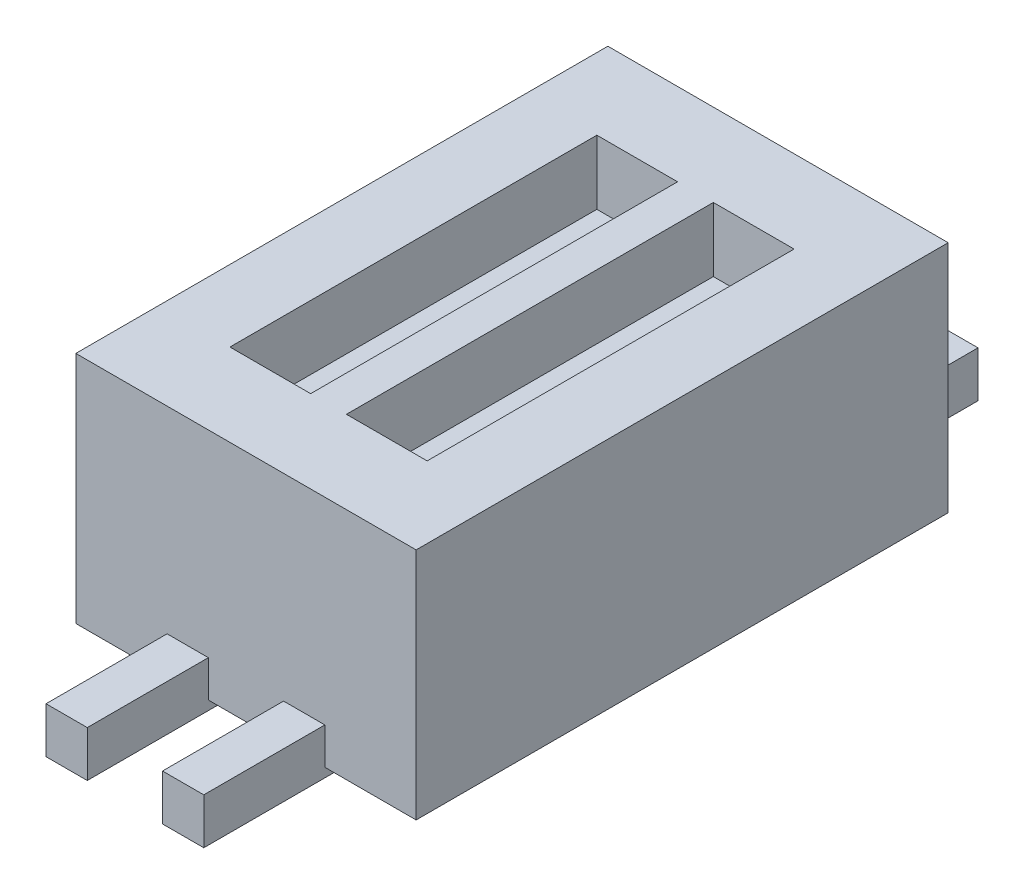
ISO-10303-21;
HEADER;
FILE_DESCRIPTION(('STEP AP214'),'2;1');
FILE_NAME('part.step','',(''),(''),'','','');
FILE_SCHEMA(('AUTOMOTIVE_DESIGN { 1 0 10303 214 1 1 1 1 }'));
ENDSEC;
DATA;
#1=APPLICATION_CONTEXT('core data for automotive mechanical design processes');
#2=APPLICATION_PROTOCOL_DEFINITION('international standard','automotive_design',2000,#1);
#3=PRODUCT_CONTEXT('',#1,'mechanical');
#4=PRODUCT('Part','Part','',(#3));
#5=PRODUCT_RELATED_PRODUCT_CATEGORY('part','',(#4));
#6=PRODUCT_DEFINITION_FORMATION('','',#4);
#7=PRODUCT_DEFINITION_CONTEXT('part definition',#1,'design');
#8=PRODUCT_DEFINITION('design','',#6,#7);
#9=PRODUCT_DEFINITION_SHAPE('','',#8);
#10=(LENGTH_UNIT() NAMED_UNIT(*) SI_UNIT(.MILLI.,.METRE.));
#11=(NAMED_UNIT(*) PLANE_ANGLE_UNIT() SI_UNIT($,.RADIAN.));
#12=(NAMED_UNIT(*) SI_UNIT($,.STERADIAN.) SOLID_ANGLE_UNIT());
#13=UNCERTAINTY_MEASURE_WITH_UNIT(LENGTH_MEASURE(1.E-05),#10,'distance_accuracy_value','');
#14=(GEOMETRIC_REPRESENTATION_CONTEXT(3) GLOBAL_UNCERTAINTY_ASSIGNED_CONTEXT((#13)) GLOBAL_UNIT_ASSIGNED_CONTEXT((#10,
#11,#12)) REPRESENTATION_CONTEXT('',''));
#15=CARTESIAN_POINT('',(0.,0.,0.));
#16=DIRECTION('',(0.,0.,1.));
#17=DIRECTION('',(1.,0.,0.));
#18=AXIS2_PLACEMENT_3D('',#15,#16,#17);
#19=CARTESIAN_POINT('',(0.,0.1,0.));
#20=DIRECTION('',(0.,1.,0.));
#21=DIRECTION('',(0.,0.,1.));
#22=AXIS2_PLACEMENT_3D('',#19,#20,#21);
#23=PLANE('',#22);
#24=DIRECTION('',(0.,0.,-1.));
#25=VECTOR('',#24,1.);
#26=CARTESIAN_POINT('',(0.41,0.1,0.));
#27=LINE('',#26,#25);
#28=CARTESIAN_POINT('',(0.41,0.1,-2.4));
#29=VERTEX_POINT('',#28);
#30=CARTESIAN_POINT('',(0.409999999999999,0.1,-2.9));
#31=VERTEX_POINT('',#30);
#32=EDGE_CURVE('E368',#29,#31,#27,.T.);
#33=ORIENTED_EDGE('',*,*,#32,.F.);
#34=DIRECTION('',(-1.,0.,0.));
#35=VECTOR('',#34,1.);
#36=CARTESIAN_POINT('',(0.,0.1,-2.4));
#37=LINE('',#36,#35);
#38=CARTESIAN_POINT('',(0.86,0.1,-2.4));
#39=VERTEX_POINT('',#38);
#40=EDGE_CURVE('E11',#39,#29,#37,.T.);
#41=ORIENTED_EDGE('',*,*,#40,.F.);
#42=DIRECTION('',(0.,0.,1.));
#43=VECTOR('',#42,1.);
#44=CARTESIAN_POINT('',(0.86,0.1,0.));
#45=LINE('',#44,#43);
#46=CARTESIAN_POINT('',(0.859999999999999,0.1,-2.9));
#47=VERTEX_POINT('',#46);
#48=EDGE_CURVE('E365',#47,#39,#45,.T.);
#49=ORIENTED_EDGE('',*,*,#48,.F.);
#50=DIRECTION('',(-1.,0.,0.));
#51=VECTOR('',#50,1.);
#52=CARTESIAN_POINT('',(-1.855,0.1,-2.9));
#53=LINE('',#52,#51);
#54=CARTESIAN_POINT('',(1.855,0.1,-2.9));
#55=VERTEX_POINT('',#54);
#56=EDGE_CURVE('E485',#55,#47,#53,.T.);
#57=ORIENTED_EDGE('',*,*,#56,.F.);
#58=DIRECTION('',(0.,0.,-1.));
#59=VECTOR('',#58,1.);
#60=CARTESIAN_POINT('',(1.855,0.1,-2.9));
#61=LINE('',#60,#59);
#62=CARTESIAN_POINT('',(1.855,0.1,2.9));
#63=VERTEX_POINT('',#62);
#64=EDGE_CURVE('E470',#63,#55,#61,.T.);
#65=ORIENTED_EDGE('',*,*,#64,.F.);
#66=DIRECTION('',(1.,0.,0.));
#67=VECTOR('',#66,1.);
#68=CARTESIAN_POINT('',(-1.855,0.1,2.9));
#69=LINE('',#68,#67);
#70=CARTESIAN_POINT('',(0.859999999999999,0.1,2.9));
#71=VERTEX_POINT('',#70);
#72=EDGE_CURVE('E491',#71,#63,#69,.T.);
#73=ORIENTED_EDGE('',*,*,#72,.F.);
#74=DIRECTION('',(0.,0.,1.));
#75=VECTOR('',#74,1.);
#76=CARTESIAN_POINT('',(0.86,0.1,0.));
#77=LINE('',#76,#75);
#78=CARTESIAN_POINT('',(0.86,0.1,2.4));
#79=VERTEX_POINT('',#78);
#80=EDGE_CURVE('E512',#79,#71,#77,.T.);
#81=ORIENTED_EDGE('',*,*,#80,.F.);
#82=DIRECTION('',(1.,0.,0.));
#83=VECTOR('',#82,1.);
#84=CARTESIAN_POINT('',(0.,0.1,2.4));
#85=LINE('',#84,#83);
#86=CARTESIAN_POINT('',(0.41,0.1,2.4));
#87=VERTEX_POINT('',#86);
#88=EDGE_CURVE('E509',#87,#79,#85,.T.);
#89=ORIENTED_EDGE('',*,*,#88,.F.);
#90=DIRECTION('',(0.,0.,-1.));
#91=VECTOR('',#90,1.);
#92=CARTESIAN_POINT('',(0.41,0.1,0.));
#93=LINE('',#92,#91);
#94=CARTESIAN_POINT('',(0.409999999999999,0.1,2.9));
#95=VERTEX_POINT('',#94);
#96=EDGE_CURVE('E506',#95,#87,#93,.T.);
#97=ORIENTED_EDGE('',*,*,#96,.F.);
#98=CARTESIAN_POINT('',(-0.41,0.1,2.9));
#99=VERTEX_POINT('',#98);
#100=EDGE_CURVE('E494',#99,#95,#69,.T.);
#101=ORIENTED_EDGE('',*,*,#100,.F.);
#102=DIRECTION('',(0.,0.,1.));
#103=VECTOR('',#102,1.);
#104=CARTESIAN_POINT('',(-0.41,0.1,0.));
#105=LINE('',#104,#103);
#106=CARTESIAN_POINT('',(-0.41,0.1,2.4));
#107=VERTEX_POINT('',#106);
#108=EDGE_CURVE('E523',#107,#99,#105,.T.);
#109=ORIENTED_EDGE('',*,*,#108,.F.);
#110=DIRECTION('',(1.,0.,0.));
#111=VECTOR('',#110,1.);
#112=CARTESIAN_POINT('',(0.,0.1,2.4));
#113=LINE('',#112,#111);
#114=CARTESIAN_POINT('',(-0.86,0.1,2.4));
#115=VERTEX_POINT('',#114);
#116=EDGE_CURVE('E520',#115,#107,#113,.T.);
#117=ORIENTED_EDGE('',*,*,#116,.F.);
#118=DIRECTION('',(0.,0.,-1.));
#119=VECTOR('',#118,1.);
#120=CARTESIAN_POINT('',(-0.86,0.1,0.));
#121=LINE('',#120,#119);
#122=CARTESIAN_POINT('',(-0.860000000000001,0.1,2.9));
#123=VERTEX_POINT('',#122);
#124=EDGE_CURVE('E517',#123,#115,#121,.T.);
#125=ORIENTED_EDGE('',*,*,#124,.F.);
#126=CARTESIAN_POINT('',(-1.855,0.1,2.9));
#127=VERTEX_POINT('',#126);
#128=EDGE_CURVE('E475',#127,#123,#69,.T.);
#129=ORIENTED_EDGE('',*,*,#128,.F.);
#130=DIRECTION('',(0.,0.,1.));
#131=VECTOR('',#130,1.);
#132=CARTESIAN_POINT('',(-1.855,0.1,-2.9));
#133=LINE('',#132,#131);
#134=CARTESIAN_POINT('',(-1.855,0.1,-2.9));
#135=VERTEX_POINT('',#134);
#136=EDGE_CURVE('E488',#135,#127,#133,.T.);
#137=ORIENTED_EDGE('',*,*,#136,.F.);
#138=CARTESIAN_POINT('',(-0.860000000000001,0.1,-2.9));
#139=VERTEX_POINT('',#138);
#140=EDGE_CURVE('E484',#139,#135,#53,.T.);
#141=ORIENTED_EDGE('',*,*,#140,.F.);
#142=DIRECTION('',(0.,0.,-1.));
#143=VECTOR('',#142,1.);
#144=CARTESIAN_POINT('',(-0.86,0.1,0.));
#145=LINE('',#144,#143);
#146=CARTESIAN_POINT('',(-0.86,0.1,-2.4));
#147=VERTEX_POINT('',#146);
#148=EDGE_CURVE('E401',#147,#139,#145,.T.);
#149=ORIENTED_EDGE('',*,*,#148,.F.);
#150=DIRECTION('',(-1.,0.,0.));
#151=VECTOR('',#150,1.);
#152=CARTESIAN_POINT('',(0.,0.1,-2.4));
#153=LINE('',#152,#151);
#154=CARTESIAN_POINT('',(-0.41,0.1,-2.4));
#155=VERTEX_POINT('',#154);
#156=EDGE_CURVE('E537',#155,#147,#153,.T.);
#157=ORIENTED_EDGE('',*,*,#156,.F.);
#158=DIRECTION('',(0.,0.,1.));
#159=VECTOR('',#158,1.);
#160=CARTESIAN_POINT('',(-0.41,0.1,0.));
#161=LINE('',#160,#159);
#162=CARTESIAN_POINT('',(-0.41,0.1,-2.9));
#163=VERTEX_POINT('',#162);
#164=EDGE_CURVE('E398',#163,#155,#161,.T.);
#165=ORIENTED_EDGE('',*,*,#164,.F.);
#166=EDGE_CURVE('E489',#31,#163,#53,.T.);
#167=ORIENTED_EDGE('',*,*,#166,.F.);
#168=EDGE_LOOP('',(#33,#41,#49,#57,#65,#73,#81,#89,#97,#101,#109,#117,#125,#129,#137,#141,#149,
#157,#165,#167));
#169=FACE_BOUND('',#168,.T.);
#170=ADVANCED_FACE('F37',(#169),#23,.F.);
#171=CARTESIAN_POINT('',(-1.855,2.65,-2.9));
#172=DIRECTION('',(0.,0.,1.));
#173=DIRECTION('',(1.,0.,0.));
#174=AXIS2_PLACEMENT_3D('',#171,#172,#173);
#175=PLANE('',#174);
#176=DIRECTION('',(0.,1.,0.));
#177=VECTOR('',#176,1.);
#178=CARTESIAN_POINT('',(0.41,2.65,-2.9));
#179=LINE('',#178,#177);
#180=CARTESIAN_POINT('',(0.41,0.5,-2.9));
#181=VERTEX_POINT('',#180);
#182=EDGE_CURVE('E45',#31,#181,#179,.T.);
#183=ORIENTED_EDGE('',*,*,#182,.F.);
#184=ORIENTED_EDGE('',*,*,#166,.T.);
#185=DIRECTION('',(0.,-1.,0.));
#186=VECTOR('',#185,1.);
#187=CARTESIAN_POINT('',(-0.41,2.65,-2.9));
#188=LINE('',#187,#186);
#189=CARTESIAN_POINT('',(-0.41,0.5,-2.9));
#190=VERTEX_POINT('',#189);
#191=EDGE_CURVE('E531',#190,#163,#188,.T.);
#192=ORIENTED_EDGE('',*,*,#191,.F.);
#193=DIRECTION('',(1.,0.,0.));
#194=VECTOR('',#193,1.);
#195=CARTESIAN_POINT('',(-1.855,0.5,-2.9));
#196=LINE('',#195,#194);
#197=CARTESIAN_POINT('',(-0.86,0.5,-2.9));
#198=VERTEX_POINT('',#197);
#199=EDGE_CURVE('E528',#198,#190,#196,.T.);
#200=ORIENTED_EDGE('',*,*,#199,.F.);
#201=DIRECTION('',(0.,1.,0.));
#202=VECTOR('',#201,1.);
#203=CARTESIAN_POINT('',(-0.86,2.65,-2.9));
#204=LINE('',#203,#202);
#205=EDGE_CURVE('E534',#139,#198,#204,.T.);
#206=ORIENTED_EDGE('',*,*,#205,.F.);
#207=ORIENTED_EDGE('',*,*,#140,.T.);
#208=DIRECTION('',(0.,-1.,0.));
#209=VECTOR('',#208,1.);
#210=CARTESIAN_POINT('',(-1.855,2.65,-2.9));
#211=LINE('',#210,#209);
#212=CARTESIAN_POINT('',(-1.855,2.65,-2.9));
#213=VERTEX_POINT('',#212);
#214=EDGE_CURVE('E500',#213,#135,#211,.T.);
#215=ORIENTED_EDGE('',*,*,#214,.F.);
#216=DIRECTION('',(-1.,0.,0.));
#217=VECTOR('',#216,1.);
#218=CARTESIAN_POINT('',(-1.855,2.65,-2.9));
#219=LINE('',#218,#217);
#220=CARTESIAN_POINT('',(1.855,2.65,-2.9));
#221=VERTEX_POINT('',#220);
#222=EDGE_CURVE('E474',#221,#213,#219,.T.);
#223=ORIENTED_EDGE('',*,*,#222,.F.);
#224=DIRECTION('',(0.,-1.,0.));
#225=VECTOR('',#224,1.);
#226=CARTESIAN_POINT('',(1.855,2.65,-2.9));
#227=LINE('',#226,#225);
#228=EDGE_CURVE('E503',#221,#55,#227,.T.);
#229=ORIENTED_EDGE('',*,*,#228,.T.);
#230=ORIENTED_EDGE('',*,*,#56,.T.);
#231=DIRECTION('',(0.,-1.,0.));
#232=VECTOR('',#231,1.);
#233=CARTESIAN_POINT('',(0.86,2.65,-2.9));
#234=LINE('',#233,#232);
#235=CARTESIAN_POINT('',(0.86,0.5,-2.9));
#236=VERTEX_POINT('',#235);
#237=EDGE_CURVE('E543',#236,#47,#234,.T.);
#238=ORIENTED_EDGE('',*,*,#237,.F.);
#239=DIRECTION('',(1.,0.,0.));
#240=VECTOR('',#239,1.);
#241=CARTESIAN_POINT('',(-1.855,0.5,-2.9));
#242=LINE('',#241,#240);
#243=EDGE_CURVE('E540',#181,#236,#242,.T.);
#244=ORIENTED_EDGE('',*,*,#243,.F.);
#245=EDGE_LOOP('',(#183,#184,#192,#200,#206,#207,#215,#223,#229,#230,#238,#244));
#246=FACE_BOUND('',#245,.T.);
#247=ADVANCED_FACE('F572',(#246),#175,.F.);
#248=CARTESIAN_POINT('',(-1.855,2.65,2.9));
#249=DIRECTION('',(0.,0.,-1.));
#250=DIRECTION('',(-1.,0.,0.));
#251=AXIS2_PLACEMENT_3D('',#248,#249,#250);
#252=PLANE('',#251);
#253=DIRECTION('',(0.,1.,0.));
#254=VECTOR('',#253,1.);
#255=CARTESIAN_POINT('',(-0.41,2.65,2.9));
#256=LINE('',#255,#254);
#257=CARTESIAN_POINT('',(-0.41,0.5,2.9));
#258=VERTEX_POINT('',#257);
#259=EDGE_CURVE('E434',#99,#258,#256,.T.);
#260=ORIENTED_EDGE('',*,*,#259,.F.);
#261=ORIENTED_EDGE('',*,*,#100,.T.);
#262=DIRECTION('',(0.,-1.,0.));
#263=VECTOR('',#262,1.);
#264=CARTESIAN_POINT('',(0.41,2.65,2.9));
#265=LINE('',#264,#263);
#266=CARTESIAN_POINT('',(0.41,0.5,2.9));
#267=VERTEX_POINT('',#266);
#268=EDGE_CURVE('E464',#267,#95,#265,.T.);
#269=ORIENTED_EDGE('',*,*,#268,.F.);
#270=DIRECTION('',(1.,0.,0.));
#271=VECTOR('',#270,1.);
#272=CARTESIAN_POINT('',(-1.855,0.5,2.9));
#273=LINE('',#272,#271);
#274=CARTESIAN_POINT('',(0.86,0.5,2.9));
#275=VERTEX_POINT('',#274);
#276=EDGE_CURVE('E515',#267,#275,#273,.T.);
#277=ORIENTED_EDGE('',*,*,#276,.T.);
#278=DIRECTION('',(0.,1.,0.));
#279=VECTOR('',#278,1.);
#280=CARTESIAN_POINT('',(0.86,2.65,2.9));
#281=LINE('',#280,#279);
#282=EDGE_CURVE('E467',#71,#275,#281,.T.);
#283=ORIENTED_EDGE('',*,*,#282,.F.);
#284=ORIENTED_EDGE('',*,*,#72,.T.);
#285=DIRECTION('',(0.,-1.,0.));
#286=VECTOR('',#285,1.);
#287=CARTESIAN_POINT('',(1.855,2.65,2.9));
#288=LINE('',#287,#286);
#289=CARTESIAN_POINT('',(1.855,2.65,2.9));
#290=VERTEX_POINT('',#289);
#291=EDGE_CURVE('E481',#290,#63,#288,.T.);
#292=ORIENTED_EDGE('',*,*,#291,.F.);
#293=DIRECTION('',(1.,0.,0.));
#294=VECTOR('',#293,1.);
#295=CARTESIAN_POINT('',(-1.855,2.65,2.9));
#296=LINE('',#295,#294);
#297=CARTESIAN_POINT('',(-1.855,2.65,2.9));
#298=VERTEX_POINT('',#297);
#299=EDGE_CURVE('E479',#298,#290,#296,.T.);
#300=ORIENTED_EDGE('',*,*,#299,.F.);
#301=DIRECTION('',(0.,-1.,0.));
#302=VECTOR('',#301,1.);
#303=CARTESIAN_POINT('',(-1.855,2.65,2.9));
#304=LINE('',#303,#302);
#305=EDGE_CURVE('E497',#298,#127,#304,.T.);
#306=ORIENTED_EDGE('',*,*,#305,.T.);
#307=ORIENTED_EDGE('',*,*,#128,.T.);
#308=DIRECTION('',(0.,-1.,0.));
#309=VECTOR('',#308,1.);
#310=CARTESIAN_POINT('',(-0.86,2.65,2.9));
#311=LINE('',#310,#309);
#312=CARTESIAN_POINT('',(-0.86,0.5,2.9));
#313=VERTEX_POINT('',#312);
#314=EDGE_CURVE('E431',#313,#123,#311,.T.);
#315=ORIENTED_EDGE('',*,*,#314,.F.);
#316=DIRECTION('',(1.,0.,0.));
#317=VECTOR('',#316,1.);
#318=CARTESIAN_POINT('',(-1.855,0.5,2.9));
#319=LINE('',#318,#317);
#320=EDGE_CURVE('E526',#313,#258,#319,.T.);
#321=ORIENTED_EDGE('',*,*,#320,.T.);
#322=EDGE_LOOP('',(#260,#261,#269,#277,#283,#284,#292,#300,#306,#307,#315,#321));
#323=FACE_BOUND('',#322,.T.);
#324=ADVANCED_FACE('F581',(#323),#252,.F.);
#325=CARTESIAN_POINT('',(1.855,2.65,-2.9));
#326=DIRECTION('',(-1.,0.,0.));
#327=DIRECTION('',(0.,0.,1.));
#328=AXIS2_PLACEMENT_3D('',#325,#326,#327);
#329=PLANE('',#328);
#330=ORIENTED_EDGE('',*,*,#64,.T.);
#331=ORIENTED_EDGE('',*,*,#228,.F.);
#332=DIRECTION('',(0.,0.,-1.));
#333=VECTOR('',#332,1.);
#334=CARTESIAN_POINT('',(1.855,2.65,-2.9));
#335=LINE('',#334,#333);
#336=EDGE_CURVE('E471',#290,#221,#335,.T.);
#337=ORIENTED_EDGE('',*,*,#336,.F.);
#338=ORIENTED_EDGE('',*,*,#291,.T.);
#339=EDGE_LOOP('',(#330,#331,#337,#338));
#340=FACE_BOUND('',#339,.T.);
#341=ADVANCED_FACE('F39',(#340),#329,.F.);
#342=CARTESIAN_POINT('',(-1.855,2.65,-2.9));
#343=DIRECTION('',(1.,0.,0.));
#344=DIRECTION('',(0.,0.,-1.));
#345=AXIS2_PLACEMENT_3D('',#342,#343,#344);
#346=PLANE('',#345);
#347=ORIENTED_EDGE('',*,*,#136,.T.);
#348=ORIENTED_EDGE('',*,*,#305,.F.);
#349=DIRECTION('',(0.,0.,1.));
#350=VECTOR('',#349,1.);
#351=CARTESIAN_POINT('',(-1.855,2.65,-2.9));
#352=LINE('',#351,#350);
#353=EDGE_CURVE('E477',#213,#298,#352,.T.);
#354=ORIENTED_EDGE('',*,*,#353,.F.);
#355=ORIENTED_EDGE('',*,*,#214,.T.);
#356=EDGE_LOOP('',(#347,#348,#354,#355));
#357=FACE_BOUND('',#356,.T.);
#358=ADVANCED_FACE('F631',(#357),#346,.F.);
#359=CARTESIAN_POINT('',(0.,2.65,0.));
#360=DIRECTION('',(0.,1.,0.));
#361=DIRECTION('',(0.,0.,1.));
#362=AXIS2_PLACEMENT_3D('',#359,#360,#361);
#363=PLANE('',#362);
#364=DIRECTION('',(0.,0.,-1.));
#365=VECTOR('',#364,1.);
#366=CARTESIAN_POINT('',(1.075,2.65,-2.));
#367=LINE('',#366,#365);
#368=CARTESIAN_POINT('',(1.075,2.65,2.));
#369=VERTEX_POINT('',#368);
#370=CARTESIAN_POINT('',(1.075,2.65,-2.));
#371=VERTEX_POINT('',#370);
#372=EDGE_CURVE('E52',#369,#371,#367,.T.);
#373=ORIENTED_EDGE('',*,*,#372,.F.);
#374=DIRECTION('',(1.,0.,0.));
#375=VECTOR('',#374,1.);
#376=CARTESIAN_POINT('',(0.195,2.65,2.));
#377=LINE('',#376,#375);
#378=CARTESIAN_POINT('',(0.195,2.65,2.));
#379=VERTEX_POINT('',#378);
#380=EDGE_CURVE('E290',#379,#369,#377,.T.);
#381=ORIENTED_EDGE('',*,*,#380,.F.);
#382=DIRECTION('',(0.,0.,1.));
#383=VECTOR('',#382,1.);
#384=CARTESIAN_POINT('',(0.195,2.65,-2.));
#385=LINE('',#384,#383);
#386=CARTESIAN_POINT('',(0.195,2.65,-2.));
#387=VERTEX_POINT('',#386);
#388=EDGE_CURVE('E293',#387,#379,#385,.T.);
#389=ORIENTED_EDGE('',*,*,#388,.F.);
#390=DIRECTION('',(-1.,0.,0.));
#391=VECTOR('',#390,1.);
#392=CARTESIAN_POINT('',(0.195,2.65,-2.));
#393=LINE('',#392,#391);
#394=EDGE_CURVE('E299',#371,#387,#393,.T.);
#395=ORIENTED_EDGE('',*,*,#394,.F.);
#396=EDGE_LOOP('',(#373,#381,#389,#395));
#397=FACE_BOUND('',#396,.T.);
#398=DIRECTION('',(0.,0.,-1.));
#399=VECTOR('',#398,1.);
#400=CARTESIAN_POINT('',(-0.195000000000001,2.65,-2.));
#401=LINE('',#400,#399);
#402=CARTESIAN_POINT('',(-0.195,2.65,2.));
#403=VERTEX_POINT('',#402);
#404=CARTESIAN_POINT('',(-0.195000000000001,2.65,-2.));
#405=VERTEX_POINT('',#404);
#406=EDGE_CURVE('E60',#403,#405,#401,.T.);
#407=ORIENTED_EDGE('',*,*,#406,.F.);
#408=DIRECTION('',(1.,0.,0.));
#409=VECTOR('',#408,1.);
#410=CARTESIAN_POINT('',(-1.075,2.65,2.));
#411=LINE('',#410,#409);
#412=CARTESIAN_POINT('',(-1.075,2.65,2.));
#413=VERTEX_POINT('',#412);
#414=EDGE_CURVE('E312',#413,#403,#411,.T.);
#415=ORIENTED_EDGE('',*,*,#414,.F.);
#416=DIRECTION('',(0.,0.,1.));
#417=VECTOR('',#416,1.);
#418=CARTESIAN_POINT('',(-1.075,2.65,-2.));
#419=LINE('',#418,#417);
#420=CARTESIAN_POINT('',(-1.075,2.65,-2.));
#421=VERTEX_POINT('',#420);
#422=EDGE_CURVE('E326',#421,#413,#419,.T.);
#423=ORIENTED_EDGE('',*,*,#422,.F.);
#424=DIRECTION('',(-1.,0.,0.));
#425=VECTOR('',#424,1.);
#426=CARTESIAN_POINT('',(-1.075,2.65,-2.));
#427=LINE('',#426,#425);
#428=EDGE_CURVE('E323',#405,#421,#427,.T.);
#429=ORIENTED_EDGE('',*,*,#428,.F.);
#430=EDGE_LOOP('',(#407,#415,#423,#429));
#431=FACE_BOUND('',#430,.T.);
#432=ORIENTED_EDGE('',*,*,#336,.T.);
#433=ORIENTED_EDGE('',*,*,#222,.T.);
#434=ORIENTED_EDGE('',*,*,#353,.T.);
#435=ORIENTED_EDGE('',*,*,#299,.T.);
#436=EDGE_LOOP('',(#432,#433,#434,#435));
#437=FACE_BOUND('',#436,.T.);
#438=ADVANCED_FACE('F627',(#397,#431,#437),#363,.T.);
#439=CARTESIAN_POINT('',(0.,0.5,0.));
#440=DIRECTION('',(0.,1.,0.));
#441=DIRECTION('',(0.,0.,1.));
#442=AXIS2_PLACEMENT_3D('',#439,#440,#441);
#443=PLANE('',#442);
#444=ORIENTED_EDGE('',*,*,#276,.F.);
#445=DIRECTION('',(0.,0.,1.));
#446=VECTOR('',#445,1.);
#447=CARTESIAN_POINT('',(0.41,0.5,2.4));
#448=LINE('',#447,#446);
#449=CARTESIAN_POINT('',(0.41,0.5,4.22));
#450=VERTEX_POINT('',#449);
#451=EDGE_CURVE('E441',#267,#450,#448,.T.);
#452=ORIENTED_EDGE('',*,*,#451,.T.);
#453=DIRECTION('',(1.,0.,0.));
#454=VECTOR('',#453,1.);
#455=CARTESIAN_POINT('',(0.41,0.5,4.22));
#456=LINE('',#455,#454);
#457=CARTESIAN_POINT('',(0.86,0.5,4.22));
#458=VERTEX_POINT('',#457);
#459=EDGE_CURVE('E444',#450,#458,#456,.T.);
#460=ORIENTED_EDGE('',*,*,#459,.T.);
#461=DIRECTION('',(0.,0.,-1.));
#462=VECTOR('',#461,1.);
#463=CARTESIAN_POINT('',(0.86,0.5,2.4));
#464=LINE('',#463,#462);
#465=EDGE_CURVE('E438',#458,#275,#464,.T.);
#466=ORIENTED_EDGE('',*,*,#465,.T.);
#467=EDGE_LOOP('',(#444,#452,#460,#466));
#468=FACE_BOUND('',#467,.T.);
#469=ADVANCED_FACE('F592',(#468),#443,.T.);
#470=CARTESIAN_POINT('',(0.86,0.5,2.4));
#471=DIRECTION('',(-1.,0.,0.));
#472=DIRECTION('',(0.,0.,1.));
#473=AXIS2_PLACEMENT_3D('',#470,#471,#472);
#474=PLANE('',#473);
#475=ORIENTED_EDGE('',*,*,#80,.T.);
#476=ORIENTED_EDGE('',*,*,#282,.T.);
#477=ORIENTED_EDGE('',*,*,#465,.F.);
#478=DIRECTION('',(0.,-1.,0.));
#479=VECTOR('',#478,1.);
#480=CARTESIAN_POINT('',(0.86,0.5,4.22));
#481=LINE('',#480,#479);
#482=CARTESIAN_POINT('',(0.86,0.,4.22));
#483=VERTEX_POINT('',#482);
#484=EDGE_CURVE('E446',#458,#483,#481,.T.);
#485=ORIENTED_EDGE('',*,*,#484,.T.);
#486=DIRECTION('',(0.,0.,-1.));
#487=VECTOR('',#486,1.);
#488=CARTESIAN_POINT('',(0.86,0.,2.4));
#489=LINE('',#488,#487);
#490=CARTESIAN_POINT('',(0.86,0.,2.4));
#491=VERTEX_POINT('',#490);
#492=EDGE_CURVE('E437',#483,#491,#489,.T.);
#493=ORIENTED_EDGE('',*,*,#492,.T.);
#494=DIRECTION('',(0.,-1.,0.));
#495=VECTOR('',#494,1.);
#496=CARTESIAN_POINT('',(0.86,0.5,2.4));
#497=LINE('',#496,#495);
#498=EDGE_CURVE('E462',#79,#491,#497,.T.);
#499=ORIENTED_EDGE('',*,*,#498,.F.);
#500=EDGE_LOOP('',(#475,#476,#477,#485,#493,#499));
#501=FACE_BOUND('',#500,.T.);
#502=ADVANCED_FACE('F596',(#501),#474,.F.);
#503=CARTESIAN_POINT('',(0.41,0.5,2.4));
#504=DIRECTION('',(0.,0.,1.));
#505=DIRECTION('',(1.,0.,0.));
#506=AXIS2_PLACEMENT_3D('',#503,#504,#505);
#507=PLANE('',#506);
#508=DIRECTION('',(0.,-1.,0.));
#509=VECTOR('',#508,1.);
#510=CARTESIAN_POINT('',(0.41,0.5,2.4));
#511=LINE('',#510,#509);
#512=CARTESIAN_POINT('',(0.41,0.,2.4));
#513=VERTEX_POINT('',#512);
#514=EDGE_CURVE('E460',#87,#513,#511,.T.);
#515=ORIENTED_EDGE('',*,*,#514,.F.);
#516=ORIENTED_EDGE('',*,*,#88,.T.);
#517=ORIENTED_EDGE('',*,*,#498,.T.);
#518=DIRECTION('',(-1.,0.,0.));
#519=VECTOR('',#518,1.);
#520=CARTESIAN_POINT('',(0.41,0.,2.4));
#521=LINE('',#520,#519);
#522=EDGE_CURVE('E449',#491,#513,#521,.T.);
#523=ORIENTED_EDGE('',*,*,#522,.T.);
#524=EDGE_LOOP('',(#515,#516,#517,#523));
#525=FACE_BOUND('',#524,.T.);
#526=ADVANCED_FACE('F599',(#525),#507,.F.);
#527=CARTESIAN_POINT('',(0.41,0.5,2.4));
#528=DIRECTION('',(1.,0.,0.));
#529=DIRECTION('',(0.,0.,-1.));
#530=AXIS2_PLACEMENT_3D('',#527,#528,#529);
#531=PLANE('',#530);
#532=ORIENTED_EDGE('',*,*,#451,.F.);
#533=ORIENTED_EDGE('',*,*,#268,.T.);
#534=ORIENTED_EDGE('',*,*,#96,.T.);
#535=ORIENTED_EDGE('',*,*,#514,.T.);
#536=DIRECTION('',(0.,0.,1.));
#537=VECTOR('',#536,1.);
#538=CARTESIAN_POINT('',(0.41,0.,2.4));
#539=LINE('',#538,#537);
#540=CARTESIAN_POINT('',(0.41,0.,4.22));
#541=VERTEX_POINT('',#540);
#542=EDGE_CURVE('E452',#513,#541,#539,.T.);
#543=ORIENTED_EDGE('',*,*,#542,.T.);
#544=DIRECTION('',(0.,-1.,0.));
#545=VECTOR('',#544,1.);
#546=CARTESIAN_POINT('',(0.41,0.5,4.22));
#547=LINE('',#546,#545);
#548=EDGE_CURVE('E457',#450,#541,#547,.T.);
#549=ORIENTED_EDGE('',*,*,#548,.F.);
#550=EDGE_LOOP('',(#532,#533,#534,#535,#543,#549));
#551=FACE_BOUND('',#550,.T.);
#552=ADVANCED_FACE('F588',(#551),#531,.F.);
#553=CARTESIAN_POINT('',(0.41,0.5,4.22));
#554=DIRECTION('',(0.,0.,-1.));
#555=DIRECTION('',(-1.,0.,0.));
#556=AXIS2_PLACEMENT_3D('',#553,#554,#555);
#557=PLANE('',#556);
#558=DIRECTION('',(1.,0.,0.));
#559=VECTOR('',#558,1.);
#560=CARTESIAN_POINT('',(0.41,0.,4.22));
#561=LINE('',#560,#559);
#562=EDGE_CURVE('E442',#541,#483,#561,.T.);
#563=ORIENTED_EDGE('',*,*,#562,.T.);
#564=ORIENTED_EDGE('',*,*,#484,.F.);
#565=ORIENTED_EDGE('',*,*,#459,.F.);
#566=ORIENTED_EDGE('',*,*,#548,.T.);
#567=EDGE_LOOP('',(#563,#564,#565,#566));
#568=FACE_BOUND('',#567,.T.);
#569=ADVANCED_FACE('F605',(#568),#557,.F.);
#570=CARTESIAN_POINT('',(0.,0.,0.));
#571=DIRECTION('',(0.,1.,0.));
#572=DIRECTION('',(0.,0.,1.));
#573=AXIS2_PLACEMENT_3D('',#570,#571,#572);
#574=PLANE('',#573);
#575=ORIENTED_EDGE('',*,*,#492,.F.);
#576=ORIENTED_EDGE('',*,*,#562,.F.);
#577=ORIENTED_EDGE('',*,*,#542,.F.);
#578=ORIENTED_EDGE('',*,*,#522,.F.);
#579=EDGE_LOOP('',(#575,#576,#577,#578));
#580=FACE_BOUND('',#579,.T.);
#581=ADVANCED_FACE('F607',(#580),#574,.F.);
#582=CARTESIAN_POINT('',(0.,0.5,0.));
#583=DIRECTION('',(0.,1.,0.));
#584=DIRECTION('',(0.,0.,1.));
#585=AXIS2_PLACEMENT_3D('',#582,#583,#584);
#586=PLANE('',#585);
#587=ORIENTED_EDGE('',*,*,#320,.F.);
#588=DIRECTION('',(0.,0.,1.));
#589=VECTOR('',#588,1.);
#590=CARTESIAN_POINT('',(-0.86,0.5,2.4));
#591=LINE('',#590,#589);
#592=CARTESIAN_POINT('',(-0.86,0.5,4.22));
#593=VERTEX_POINT('',#592);
#594=EDGE_CURVE('E408',#313,#593,#591,.T.);
#595=ORIENTED_EDGE('',*,*,#594,.T.);
#596=DIRECTION('',(1.,0.,0.));
#597=VECTOR('',#596,1.);
#598=CARTESIAN_POINT('',(-0.86,0.5,4.22));
#599=LINE('',#598,#597);
#600=CARTESIAN_POINT('',(-0.41,0.5,4.22));
#601=VERTEX_POINT('',#600);
#602=EDGE_CURVE('E411',#593,#601,#599,.T.);
#603=ORIENTED_EDGE('',*,*,#602,.T.);
#604=DIRECTION('',(0.,0.,-1.));
#605=VECTOR('',#604,1.);
#606=CARTESIAN_POINT('',(-0.41,0.5,2.4));
#607=LINE('',#606,#605);
#608=EDGE_CURVE('E405',#601,#258,#607,.T.);
#609=ORIENTED_EDGE('',*,*,#608,.T.);
#610=EDGE_LOOP('',(#587,#595,#603,#609));
#611=FACE_BOUND('',#610,.T.);
#612=ADVANCED_FACE('F609',(#611),#586,.T.);
#613=CARTESIAN_POINT('',(-0.41,0.5,2.4));
#614=DIRECTION('',(-1.,0.,0.));
#615=DIRECTION('',(0.,0.,1.));
#616=AXIS2_PLACEMENT_3D('',#613,#614,#615);
#617=PLANE('',#616);
#618=ORIENTED_EDGE('',*,*,#108,.T.);
#619=ORIENTED_EDGE('',*,*,#259,.T.);
#620=ORIENTED_EDGE('',*,*,#608,.F.);
#621=DIRECTION('',(0.,-1.,0.));
#622=VECTOR('',#621,1.);
#623=CARTESIAN_POINT('',(-0.41,0.5,4.22));
#624=LINE('',#623,#622);
#625=CARTESIAN_POINT('',(-0.41,0.,4.22));
#626=VERTEX_POINT('',#625);
#627=EDGE_CURVE('E413',#601,#626,#624,.T.);
#628=ORIENTED_EDGE('',*,*,#627,.T.);
#629=DIRECTION('',(0.,0.,-1.));
#630=VECTOR('',#629,1.);
#631=CARTESIAN_POINT('',(-0.41,0.,2.4));
#632=LINE('',#631,#630);
#633=CARTESIAN_POINT('',(-0.41,0.,2.4));
#634=VERTEX_POINT('',#633);
#635=EDGE_CURVE('E404',#626,#634,#632,.T.);
#636=ORIENTED_EDGE('',*,*,#635,.T.);
#637=DIRECTION('',(0.,-1.,0.));
#638=VECTOR('',#637,1.);
#639=CARTESIAN_POINT('',(-0.41,0.5,2.4));
#640=LINE('',#639,#638);
#641=EDGE_CURVE('E429',#107,#634,#640,.T.);
#642=ORIENTED_EDGE('',*,*,#641,.F.);
#643=EDGE_LOOP('',(#618,#619,#620,#628,#636,#642));
#644=FACE_BOUND('',#643,.T.);
#645=ADVANCED_FACE('F615',(#644),#617,.F.);
#646=CARTESIAN_POINT('',(-0.86,0.5,2.4));
#647=DIRECTION('',(0.,0.,1.));
#648=DIRECTION('',(1.,0.,0.));
#649=AXIS2_PLACEMENT_3D('',#646,#647,#648);
#650=PLANE('',#649);
#651=DIRECTION('',(0.,-1.,0.));
#652=VECTOR('',#651,1.);
#653=CARTESIAN_POINT('',(-0.86,0.5,2.4));
#654=LINE('',#653,#652);
#655=CARTESIAN_POINT('',(-0.86,0.,2.4));
#656=VERTEX_POINT('',#655);
#657=EDGE_CURVE('E427',#115,#656,#654,.T.);
#658=ORIENTED_EDGE('',*,*,#657,.F.);
#659=ORIENTED_EDGE('',*,*,#116,.T.);
#660=ORIENTED_EDGE('',*,*,#641,.T.);
#661=DIRECTION('',(-1.,0.,0.));
#662=VECTOR('',#661,1.);
#663=CARTESIAN_POINT('',(-0.86,0.,2.4));
#664=LINE('',#663,#662);
#665=EDGE_CURVE('E416',#634,#656,#664,.T.);
#666=ORIENTED_EDGE('',*,*,#665,.T.);
#667=EDGE_LOOP('',(#658,#659,#660,#666));
#668=FACE_BOUND('',#667,.T.);
#669=ADVANCED_FACE('F650',(#668),#650,.F.);
#670=CARTESIAN_POINT('',(-0.86,0.5,2.4));
#671=DIRECTION('',(1.,0.,0.));
#672=DIRECTION('',(0.,0.,-1.));
#673=AXIS2_PLACEMENT_3D('',#670,#671,#672);
#674=PLANE('',#673);
#675=ORIENTED_EDGE('',*,*,#594,.F.);
#676=ORIENTED_EDGE('',*,*,#314,.T.);
#677=ORIENTED_EDGE('',*,*,#124,.T.);
#678=ORIENTED_EDGE('',*,*,#657,.T.);
#679=DIRECTION('',(0.,0.,1.));
#680=VECTOR('',#679,1.);
#681=CARTESIAN_POINT('',(-0.86,0.,2.4));
#682=LINE('',#681,#680);
#683=CARTESIAN_POINT('',(-0.86,0.,4.22));
#684=VERTEX_POINT('',#683);
#685=EDGE_CURVE('E419',#656,#684,#682,.T.);
#686=ORIENTED_EDGE('',*,*,#685,.T.);
#687=DIRECTION('',(0.,-1.,0.));
#688=VECTOR('',#687,1.);
#689=CARTESIAN_POINT('',(-0.86,0.5,4.22));
#690=LINE('',#689,#688);
#691=EDGE_CURVE('E424',#593,#684,#690,.T.);
#692=ORIENTED_EDGE('',*,*,#691,.F.);
#693=EDGE_LOOP('',(#675,#676,#677,#678,#686,#692));
#694=FACE_BOUND('',#693,.T.);
#695=ADVANCED_FACE('F648',(#694),#674,.F.);
#696=CARTESIAN_POINT('',(-0.86,0.5,4.22));
#697=DIRECTION('',(0.,0.,-1.));
#698=DIRECTION('',(-1.,0.,0.));
#699=AXIS2_PLACEMENT_3D('',#696,#697,#698);
#700=PLANE('',#699);
#701=DIRECTION('',(1.,0.,0.));
#702=VECTOR('',#701,1.);
#703=CARTESIAN_POINT('',(-0.86,0.,4.22));
#704=LINE('',#703,#702);
#705=EDGE_CURVE('E409',#684,#626,#704,.T.);
#706=ORIENTED_EDGE('',*,*,#705,.T.);
#707=ORIENTED_EDGE('',*,*,#627,.F.);
#708=ORIENTED_EDGE('',*,*,#602,.F.);
#709=ORIENTED_EDGE('',*,*,#691,.T.);
#710=EDGE_LOOP('',(#706,#707,#708,#709));
#711=FACE_BOUND('',#710,.T.);
#712=ADVANCED_FACE('F661',(#711),#700,.F.);
#713=CARTESIAN_POINT('',(0.,0.,0.));
#714=DIRECTION('',(0.,1.,0.));
#715=DIRECTION('',(0.,0.,1.));
#716=AXIS2_PLACEMENT_3D('',#713,#714,#715);
#717=PLANE('',#716);
#718=ORIENTED_EDGE('',*,*,#635,.F.);
#719=ORIENTED_EDGE('',*,*,#705,.F.);
#720=ORIENTED_EDGE('',*,*,#685,.F.);
#721=ORIENTED_EDGE('',*,*,#665,.F.);
#722=EDGE_LOOP('',(#718,#719,#720,#721));
#723=FACE_BOUND('',#722,.T.);
#724=ADVANCED_FACE('F657',(#723),#717,.F.);
#725=CARTESIAN_POINT('',(-0.86,0.5,-2.4));
#726=DIRECTION('',(0.,0.,-1.));
#727=DIRECTION('',(-1.,0.,0.));
#728=AXIS2_PLACEMENT_3D('',#725,#726,#727);
#729=PLANE('',#728);
#730=DIRECTION('',(0.,-1.,0.));
#731=VECTOR('',#730,1.);
#732=CARTESIAN_POINT('',(-0.41,0.5,-2.4));
#733=LINE('',#732,#731);
#734=CARTESIAN_POINT('',(-0.41,0.,-2.4));
#735=VERTEX_POINT('',#734);
#736=EDGE_CURVE('E394',#155,#735,#733,.T.);
#737=ORIENTED_EDGE('',*,*,#736,.F.);
#738=ORIENTED_EDGE('',*,*,#156,.T.);
#739=DIRECTION('',(0.,-1.,0.));
#740=VECTOR('',#739,1.);
#741=CARTESIAN_POINT('',(-0.86,0.5,-2.4));
#742=LINE('',#741,#740);
#743=CARTESIAN_POINT('',(-0.86,0.,-2.4));
#744=VERTEX_POINT('',#743);
#745=EDGE_CURVE('E396',#147,#744,#742,.T.);
#746=ORIENTED_EDGE('',*,*,#745,.T.);
#747=DIRECTION('',(1.,0.,0.));
#748=VECTOR('',#747,1.);
#749=CARTESIAN_POINT('',(-0.86,0.,-2.4));
#750=LINE('',#749,#748);
#751=EDGE_CURVE('E383',#744,#735,#750,.T.);
#752=ORIENTED_EDGE('',*,*,#751,.T.);
#753=EDGE_LOOP('',(#737,#738,#746,#752));
#754=FACE_BOUND('',#753,.T.);
#755=ADVANCED_FACE('F735',(#754),#729,.F.);
#756=CARTESIAN_POINT('',(-0.86,0.5,-2.4));
#757=DIRECTION('',(1.,0.,0.));
#758=DIRECTION('',(0.,0.,-1.));
#759=AXIS2_PLACEMENT_3D('',#756,#757,#758);
#760=PLANE('',#759);
#761=ORIENTED_EDGE('',*,*,#745,.F.);
#762=ORIENTED_EDGE('',*,*,#148,.T.);
#763=ORIENTED_EDGE('',*,*,#205,.T.);
#764=DIRECTION('',(0.,0.,1.));
#765=VECTOR('',#764,1.);
#766=CARTESIAN_POINT('',(-0.86,0.5,-2.4));
#767=LINE('',#766,#765);
#768=CARTESIAN_POINT('',(-0.86,0.5,-4.22));
#769=VERTEX_POINT('',#768);
#770=EDGE_CURVE('E372',#769,#198,#767,.T.);
#771=ORIENTED_EDGE('',*,*,#770,.F.);
#772=DIRECTION('',(0.,-1.,0.));
#773=VECTOR('',#772,1.);
#774=CARTESIAN_POINT('',(-0.86,0.5,-4.22));
#775=LINE('',#774,#773);
#776=CARTESIAN_POINT('',(-0.86,0.,-4.22));
#777=VERTEX_POINT('',#776);
#778=EDGE_CURVE('E380',#769,#777,#775,.T.);
#779=ORIENTED_EDGE('',*,*,#778,.T.);
#780=DIRECTION('',(0.,0.,1.));
#781=VECTOR('',#780,1.);
#782=CARTESIAN_POINT('',(-0.86,0.,-2.4));
#783=LINE('',#782,#781);
#784=EDGE_CURVE('E371',#777,#744,#783,.T.);
#785=ORIENTED_EDGE('',*,*,#784,.T.);
#786=EDGE_LOOP('',(#761,#762,#763,#771,#779,#785));
#787=FACE_BOUND('',#786,.T.);
#788=ADVANCED_FACE('F744',(#787),#760,.F.);
#789=CARTESIAN_POINT('',(-0.41,0.5,-2.4));
#790=DIRECTION('',(-1.,0.,0.));
#791=DIRECTION('',(0.,0.,1.));
#792=AXIS2_PLACEMENT_3D('',#789,#790,#791);
#793=PLANE('',#792);
#794=ORIENTED_EDGE('',*,*,#191,.T.);
#795=ORIENTED_EDGE('',*,*,#164,.T.);
#796=ORIENTED_EDGE('',*,*,#736,.T.);
#797=DIRECTION('',(0.,0.,-1.));
#798=VECTOR('',#797,1.);
#799=CARTESIAN_POINT('',(-0.41,0.,-2.4));
#800=LINE('',#799,#798);
#801=CARTESIAN_POINT('',(-0.41,0.,-4.22));
#802=VERTEX_POINT('',#801);
#803=EDGE_CURVE('E386',#735,#802,#800,.T.);
#804=ORIENTED_EDGE('',*,*,#803,.T.);
#805=DIRECTION('',(0.,-1.,0.));
#806=VECTOR('',#805,1.);
#807=CARTESIAN_POINT('',(-0.41,0.5,-4.22));
#808=LINE('',#807,#806);
#809=CARTESIAN_POINT('',(-0.41,0.5,-4.22));
#810=VERTEX_POINT('',#809);
#811=EDGE_CURVE('E391',#810,#802,#808,.T.);
#812=ORIENTED_EDGE('',*,*,#811,.F.);
#813=DIRECTION('',(0.,0.,-1.));
#814=VECTOR('',#813,1.);
#815=CARTESIAN_POINT('',(-0.41,0.5,-2.4));
#816=LINE('',#815,#814);
#817=EDGE_CURVE('E375',#190,#810,#816,.T.);
#818=ORIENTED_EDGE('',*,*,#817,.F.);
#819=EDGE_LOOP('',(#794,#795,#796,#804,#812,#818));
#820=FACE_BOUND('',#819,.T.);
#821=ADVANCED_FACE('F754',(#820),#793,.F.);
#822=CARTESIAN_POINT('',(0.,0.5,0.));
#823=DIRECTION('',(0.,-1.,0.));
#824=DIRECTION('',(0.,0.,-1.));
#825=AXIS2_PLACEMENT_3D('',#822,#823,#824);
#826=PLANE('',#825);
#827=ORIENTED_EDGE('',*,*,#770,.T.);
#828=ORIENTED_EDGE('',*,*,#199,.T.);
#829=ORIENTED_EDGE('',*,*,#817,.T.);
#830=DIRECTION('',(-1.,0.,0.));
#831=VECTOR('',#830,1.);
#832=CARTESIAN_POINT('',(-0.86,0.5,-4.22));
#833=LINE('',#832,#831);
#834=EDGE_CURVE('E378',#810,#769,#833,.T.);
#835=ORIENTED_EDGE('',*,*,#834,.T.);
#836=EDGE_LOOP('',(#827,#828,#829,#835));
#837=FACE_BOUND('',#836,.T.);
#838=ADVANCED_FACE('F764',(#837),#826,.F.);
#839=CARTESIAN_POINT('',(-0.86,0.5,-4.22));
#840=DIRECTION('',(0.,0.,1.));
#841=DIRECTION('',(1.,0.,0.));
#842=AXIS2_PLACEMENT_3D('',#839,#840,#841);
#843=PLANE('',#842);
#844=DIRECTION('',(-1.,0.,0.));
#845=VECTOR('',#844,1.);
#846=CARTESIAN_POINT('',(-0.86,0.,-4.22));
#847=LINE('',#846,#845);
#848=EDGE_CURVE('E376',#802,#777,#847,.T.);
#849=ORIENTED_EDGE('',*,*,#848,.T.);
#850=ORIENTED_EDGE('',*,*,#778,.F.);
#851=ORIENTED_EDGE('',*,*,#834,.F.);
#852=ORIENTED_EDGE('',*,*,#811,.T.);
#853=EDGE_LOOP('',(#849,#850,#851,#852));
#854=FACE_BOUND('',#853,.T.);
#855=ADVANCED_FACE('F774',(#854),#843,.F.);
#856=CARTESIAN_POINT('',(0.,0.,0.));
#857=DIRECTION('',(0.,-1.,0.));
#858=DIRECTION('',(0.,0.,-1.));
#859=AXIS2_PLACEMENT_3D('',#856,#857,#858);
#860=PLANE('',#859);
#861=ORIENTED_EDGE('',*,*,#784,.F.);
#862=ORIENTED_EDGE('',*,*,#848,.F.);
#863=ORIENTED_EDGE('',*,*,#803,.F.);
#864=ORIENTED_EDGE('',*,*,#751,.F.);
#865=EDGE_LOOP('',(#861,#862,#863,#864));
#866=FACE_BOUND('',#865,.T.);
#867=ADVANCED_FACE('F784',(#866),#860,.T.);
#868=CARTESIAN_POINT('',(0.41,0.5,-2.4));
#869=DIRECTION('',(0.,0.,-1.));
#870=DIRECTION('',(-1.,0.,0.));
#871=AXIS2_PLACEMENT_3D('',#868,#869,#870);
#872=PLANE('',#871);
#873=DIRECTION('',(0.,-1.,0.));
#874=VECTOR('',#873,1.);
#875=CARTESIAN_POINT('',(0.86,0.5,-2.4));
#876=LINE('',#875,#874);
#877=CARTESIAN_POINT('',(0.86,0.,-2.4));
#878=VERTEX_POINT('',#877);
#879=EDGE_CURVE('E361',#39,#878,#876,.T.);
#880=ORIENTED_EDGE('',*,*,#879,.F.);
#881=ORIENTED_EDGE('',*,*,#40,.T.);
#882=DIRECTION('',(0.,-1.,0.));
#883=VECTOR('',#882,1.);
#884=CARTESIAN_POINT('',(0.41,0.5,-2.4));
#885=LINE('',#884,#883);
#886=CARTESIAN_POINT('',(0.41,0.,-2.4));
#887=VERTEX_POINT('',#886);
#888=EDGE_CURVE('E363',#29,#887,#885,.T.);
#889=ORIENTED_EDGE('',*,*,#888,.T.);
#890=DIRECTION('',(1.,0.,0.));
#891=VECTOR('',#890,1.);
#892=CARTESIAN_POINT('',(0.41,0.,-2.4));
#893=LINE('',#892,#891);
#894=EDGE_CURVE('E350',#887,#878,#893,.T.);
#895=ORIENTED_EDGE('',*,*,#894,.T.);
#896=EDGE_LOOP('',(#880,#881,#889,#895));
#897=FACE_BOUND('',#896,.T.);
#898=ADVANCED_FACE('F568',(#897),#872,.F.);
#899=CARTESIAN_POINT('',(0.41,0.5,-2.4));
#900=DIRECTION('',(1.,0.,0.));
#901=DIRECTION('',(0.,0.,-1.));
#902=AXIS2_PLACEMENT_3D('',#899,#900,#901);
#903=PLANE('',#902);
#904=ORIENTED_EDGE('',*,*,#888,.F.);
#905=ORIENTED_EDGE('',*,*,#32,.T.);
#906=ORIENTED_EDGE('',*,*,#182,.T.);
#907=DIRECTION('',(0.,0.,1.));
#908=VECTOR('',#907,1.);
#909=CARTESIAN_POINT('',(0.41,0.5,-2.4));
#910=LINE('',#909,#908);
#911=CARTESIAN_POINT('',(0.41,0.5,-4.22));
#912=VERTEX_POINT('',#911);
#913=EDGE_CURVE('E339',#912,#181,#910,.T.);
#914=ORIENTED_EDGE('',*,*,#913,.F.);
#915=DIRECTION('',(0.,-1.,0.));
#916=VECTOR('',#915,1.);
#917=CARTESIAN_POINT('',(0.41,0.5,-4.22));
#918=LINE('',#917,#916);
#919=CARTESIAN_POINT('',(0.41,0.,-4.22));
#920=VERTEX_POINT('',#919);
#921=EDGE_CURVE('E347',#912,#920,#918,.T.);
#922=ORIENTED_EDGE('',*,*,#921,.T.);
#923=DIRECTION('',(0.,0.,1.));
#924=VECTOR('',#923,1.);
#925=CARTESIAN_POINT('',(0.41,0.,-2.4));
#926=LINE('',#925,#924);
#927=EDGE_CURVE('E333',#920,#887,#926,.T.);
#928=ORIENTED_EDGE('',*,*,#927,.T.);
#929=EDGE_LOOP('',(#904,#905,#906,#914,#922,#928));
#930=FACE_BOUND('',#929,.T.);
#931=ADVANCED_FACE('F549',(#930),#903,.F.);
#932=CARTESIAN_POINT('',(0.86,0.5,-2.4));
#933=DIRECTION('',(-1.,0.,0.));
#934=DIRECTION('',(0.,0.,1.));
#935=AXIS2_PLACEMENT_3D('',#932,#933,#934);
#936=PLANE('',#935);
#937=ORIENTED_EDGE('',*,*,#237,.T.);
#938=ORIENTED_EDGE('',*,*,#48,.T.);
#939=ORIENTED_EDGE('',*,*,#879,.T.);
#940=DIRECTION('',(0.,0.,-1.));
#941=VECTOR('',#940,1.);
#942=CARTESIAN_POINT('',(0.86,0.,-2.4));
#943=LINE('',#942,#941);
#944=CARTESIAN_POINT('',(0.86,0.,-4.22));
#945=VERTEX_POINT('',#944);
#946=EDGE_CURVE('E353',#878,#945,#943,.T.);
#947=ORIENTED_EDGE('',*,*,#946,.T.);
#948=DIRECTION('',(0.,-1.,0.));
#949=VECTOR('',#948,1.);
#950=CARTESIAN_POINT('',(0.86,0.5,-4.22));
#951=LINE('',#950,#949);
#952=CARTESIAN_POINT('',(0.86,0.5,-4.22));
#953=VERTEX_POINT('',#952);
#954=EDGE_CURVE('E358',#953,#945,#951,.T.);
#955=ORIENTED_EDGE('',*,*,#954,.F.);
#956=DIRECTION('',(0.,0.,-1.));
#957=VECTOR('',#956,1.);
#958=CARTESIAN_POINT('',(0.86,0.5,-2.4));
#959=LINE('',#958,#957);
#960=EDGE_CURVE('E342',#236,#953,#959,.T.);
#961=ORIENTED_EDGE('',*,*,#960,.F.);
#962=EDGE_LOOP('',(#937,#938,#939,#947,#955,#961));
#963=FACE_BOUND('',#962,.T.);
#964=ADVANCED_FACE('F571',(#963),#936,.F.);
#965=CARTESIAN_POINT('',(0.,0.5,0.));
#966=DIRECTION('',(0.,-1.,0.));
#967=DIRECTION('',(0.,0.,-1.));
#968=AXIS2_PLACEMENT_3D('',#965,#966,#967);
#969=PLANE('',#968);
#970=ORIENTED_EDGE('',*,*,#913,.T.);
#971=ORIENTED_EDGE('',*,*,#243,.T.);
#972=ORIENTED_EDGE('',*,*,#960,.T.);
#973=DIRECTION('',(-1.,0.,0.));
#974=VECTOR('',#973,1.);
#975=CARTESIAN_POINT('',(0.41,0.5,-4.22));
#976=LINE('',#975,#974);
#977=EDGE_CURVE('E345',#953,#912,#976,.T.);
#978=ORIENTED_EDGE('',*,*,#977,.T.);
#979=EDGE_LOOP('',(#970,#971,#972,#978));
#980=FACE_BOUND('',#979,.T.);
#981=ADVANCED_FACE('F553',(#980),#969,.F.);
#982=CARTESIAN_POINT('',(0.41,0.5,-4.22));
#983=DIRECTION('',(0.,0.,1.));
#984=DIRECTION('',(1.,0.,0.));
#985=AXIS2_PLACEMENT_3D('',#982,#983,#984);
#986=PLANE('',#985);
#987=DIRECTION('',(-1.,0.,0.));
#988=VECTOR('',#987,1.);
#989=CARTESIAN_POINT('',(0.41,0.,-4.22));
#990=LINE('',#989,#988);
#991=EDGE_CURVE('E343',#945,#920,#990,.T.);
#992=ORIENTED_EDGE('',*,*,#991,.T.);
#993=ORIENTED_EDGE('',*,*,#921,.F.);
#994=ORIENTED_EDGE('',*,*,#977,.F.);
#995=ORIENTED_EDGE('',*,*,#954,.T.);
#996=EDGE_LOOP('',(#992,#993,#994,#995));
#997=FACE_BOUND('',#996,.T.);
#998=ADVANCED_FACE('F559',(#997),#986,.F.);
#999=CARTESIAN_POINT('',(0.,0.,0.));
#1000=DIRECTION('',(0.,-1.,0.));
#1001=DIRECTION('',(0.,0.,-1.));
#1002=AXIS2_PLACEMENT_3D('',#999,#1000,#1001);
#1003=PLANE('',#1002);
#1004=ORIENTED_EDGE('',*,*,#927,.F.);
#1005=ORIENTED_EDGE('',*,*,#991,.F.);
#1006=ORIENTED_EDGE('',*,*,#946,.F.);
#1007=ORIENTED_EDGE('',*,*,#894,.F.);
#1008=EDGE_LOOP('',(#1004,#1005,#1006,#1007));
#1009=FACE_BOUND('',#1008,.T.);
#1010=ADVANCED_FACE('F564',(#1009),#1003,.T.);
#1011=CARTESIAN_POINT('',(-0.195000000000001,1.95,-2.));
#1012=DIRECTION('',(1.,0.,0.));
#1013=DIRECTION('',(0.,0.,-1.));
#1014=AXIS2_PLACEMENT_3D('',#1011,#1012,#1013);
#1015=PLANE('',#1014);
#1016=ORIENTED_EDGE('',*,*,#406,.T.);
#1017=DIRECTION('',(0.,1.,0.));
#1018=VECTOR('',#1017,1.);
#1019=CARTESIAN_POINT('',(-0.195000000000001,1.95,-2.));
#1020=LINE('',#1019,#1018);
#1021=CARTESIAN_POINT('',(-0.195000000000001,1.95,-2.));
#1022=VERTEX_POINT('',#1021);
#1023=EDGE_CURVE('E321',#1022,#405,#1020,.T.);
#1024=ORIENTED_EDGE('',*,*,#1023,.F.);
#1025=DIRECTION('',(0.,0.,-1.));
#1026=VECTOR('',#1025,1.);
#1027=CARTESIAN_POINT('',(-0.195000000000001,1.95,-2.));
#1028=LINE('',#1027,#1026);
#1029=CARTESIAN_POINT('',(-0.195,1.95,2.));
#1030=VERTEX_POINT('',#1029);
#1031=EDGE_CURVE('E308',#1030,#1022,#1028,.T.);
#1032=ORIENTED_EDGE('',*,*,#1031,.F.);
#1033=DIRECTION('',(0.,1.,0.));
#1034=VECTOR('',#1033,1.);
#1035=CARTESIAN_POINT('',(-0.195,1.95,2.));
#1036=LINE('',#1035,#1034);
#1037=EDGE_CURVE('E331',#1030,#403,#1036,.T.);
#1038=ORIENTED_EDGE('',*,*,#1037,.T.);
#1039=EDGE_LOOP('',(#1016,#1024,#1032,#1038));
#1040=FACE_BOUND('',#1039,.T.);
#1041=ADVANCED_FACE('F843',(#1040),#1015,.F.);
#1042=CARTESIAN_POINT('',(-1.075,1.95,2.));
#1043=DIRECTION('',(0.,0.,1.));
#1044=DIRECTION('',(1.,0.,0.));
#1045=AXIS2_PLACEMENT_3D('',#1042,#1043,#1044);
#1046=PLANE('',#1045);
#1047=ORIENTED_EDGE('',*,*,#414,.T.);
#1048=ORIENTED_EDGE('',*,*,#1037,.F.);
#1049=DIRECTION('',(1.,0.,0.));
#1050=VECTOR('',#1049,1.);
#1051=CARTESIAN_POINT('',(-1.075,1.95,2.));
#1052=LINE('',#1051,#1050);
#1053=CARTESIAN_POINT('',(-1.075,1.95,2.));
#1054=VERTEX_POINT('',#1053);
#1055=EDGE_CURVE('E318',#1054,#1030,#1052,.T.);
#1056=ORIENTED_EDGE('',*,*,#1055,.F.);
#1057=DIRECTION('',(0.,1.,0.));
#1058=VECTOR('',#1057,1.);
#1059=CARTESIAN_POINT('',(-1.075,1.95,2.));
#1060=LINE('',#1059,#1058);
#1061=EDGE_CURVE('E334',#1054,#413,#1060,.T.);
#1062=ORIENTED_EDGE('',*,*,#1061,.T.);
#1063=EDGE_LOOP('',(#1047,#1048,#1056,#1062));
#1064=FACE_BOUND('',#1063,.T.);
#1065=ADVANCED_FACE('F860',(#1064),#1046,.F.);
#1066=CARTESIAN_POINT('',(-1.075,1.95,-2.));
#1067=DIRECTION('',(-1.,0.,0.));
#1068=DIRECTION('',(0.,0.,1.));
#1069=AXIS2_PLACEMENT_3D('',#1066,#1067,#1068);
#1070=PLANE('',#1069);
#1071=ORIENTED_EDGE('',*,*,#422,.T.);
#1072=ORIENTED_EDGE('',*,*,#1061,.F.);
#1073=DIRECTION('',(0.,0.,1.));
#1074=VECTOR('',#1073,1.);
#1075=CARTESIAN_POINT('',(-1.075,1.95,-2.));
#1076=LINE('',#1075,#1074);
#1077=CARTESIAN_POINT('',(-1.075,1.95,-2.));
#1078=VERTEX_POINT('',#1077);
#1079=EDGE_CURVE('E315',#1078,#1054,#1076,.T.);
#1080=ORIENTED_EDGE('',*,*,#1079,.F.);
#1081=DIRECTION('',(0.,1.,0.));
#1082=VECTOR('',#1081,1.);
#1083=CARTESIAN_POINT('',(-1.075,1.95,-2.));
#1084=LINE('',#1083,#1082);
#1085=EDGE_CURVE('E336',#1078,#421,#1084,.T.);
#1086=ORIENTED_EDGE('',*,*,#1085,.T.);
#1087=EDGE_LOOP('',(#1071,#1072,#1080,#1086));
#1088=FACE_BOUND('',#1087,.T.);
#1089=ADVANCED_FACE('F869',(#1088),#1070,.F.);
#1090=CARTESIAN_POINT('',(-1.075,1.95,-2.));
#1091=DIRECTION('',(0.,0.,-1.));
#1092=DIRECTION('',(-1.,0.,0.));
#1093=AXIS2_PLACEMENT_3D('',#1090,#1091,#1092);
#1094=PLANE('',#1093);
#1095=ORIENTED_EDGE('',*,*,#428,.T.);
#1096=ORIENTED_EDGE('',*,*,#1085,.F.);
#1097=DIRECTION('',(-1.,0.,0.));
#1098=VECTOR('',#1097,1.);
#1099=CARTESIAN_POINT('',(-1.075,1.95,-2.));
#1100=LINE('',#1099,#1098);
#1101=EDGE_CURVE('E311',#1022,#1078,#1100,.T.);
#1102=ORIENTED_EDGE('',*,*,#1101,.F.);
#1103=ORIENTED_EDGE('',*,*,#1023,.T.);
#1104=EDGE_LOOP('',(#1095,#1096,#1102,#1103));
#1105=FACE_BOUND('',#1104,.T.);
#1106=ADVANCED_FACE('F879',(#1105),#1094,.F.);
#1107=CARTESIAN_POINT('',(0.,1.95,0.));
#1108=DIRECTION('',(0.,1.,0.));
#1109=DIRECTION('',(0.,0.,1.));
#1110=AXIS2_PLACEMENT_3D('',#1107,#1108,#1109);
#1111=PLANE('',#1110);
#1112=ORIENTED_EDGE('',*,*,#1031,.T.);
#1113=ORIENTED_EDGE('',*,*,#1101,.T.);
#1114=ORIENTED_EDGE('',*,*,#1079,.T.);
#1115=ORIENTED_EDGE('',*,*,#1055,.T.);
#1116=EDGE_LOOP('',(#1112,#1113,#1114,#1115));
#1117=FACE_BOUND('',#1116,.T.);
#1118=ADVANCED_FACE('F889',(#1117),#1111,.T.);
#1119=CARTESIAN_POINT('',(1.075,1.95,-2.));
#1120=DIRECTION('',(1.,0.,0.));
#1121=DIRECTION('',(0.,0.,-1.));
#1122=AXIS2_PLACEMENT_3D('',#1119,#1120,#1121);
#1123=PLANE('',#1122);
#1124=ORIENTED_EDGE('',*,*,#372,.T.);
#1125=DIRECTION('',(0.,1.,0.));
#1126=VECTOR('',#1125,1.);
#1127=CARTESIAN_POINT('',(1.075,1.95,-2.));
#1128=LINE('',#1127,#1126);
#1129=CARTESIAN_POINT('',(1.075,1.95,-2.));
#1130=VERTEX_POINT('',#1129);
#1131=EDGE_CURVE('E268',#1130,#371,#1128,.T.);
#1132=ORIENTED_EDGE('',*,*,#1131,.F.);
#1133=DIRECTION('',(0.,0.,-1.));
#1134=VECTOR('',#1133,1.);
#1135=CARTESIAN_POINT('',(1.075,1.95,-2.));
#1136=LINE('',#1135,#1134);
#1137=CARTESIAN_POINT('',(1.075,1.95,2.));
#1138=VERTEX_POINT('',#1137);
#1139=EDGE_CURVE('E272',#1138,#1130,#1136,.T.);
#1140=ORIENTED_EDGE('',*,*,#1139,.F.);
#1141=DIRECTION('',(0.,1.,0.));
#1142=VECTOR('',#1141,1.);
#1143=CARTESIAN_POINT('',(1.075,1.95,2.));
#1144=LINE('',#1143,#1142);
#1145=EDGE_CURVE('E303',#1138,#369,#1144,.T.);
#1146=ORIENTED_EDGE('',*,*,#1145,.T.);
#1147=EDGE_LOOP('',(#1124,#1132,#1140,#1146));
#1148=FACE_BOUND('',#1147,.T.);
#1149=ADVANCED_FACE('F270',(#1148),#1123,.F.);
#1150=CARTESIAN_POINT('',(0.195,1.95,2.));
#1151=DIRECTION('',(0.,0.,1.));
#1152=DIRECTION('',(1.,0.,0.));
#1153=AXIS2_PLACEMENT_3D('',#1150,#1151,#1152);
#1154=PLANE('',#1153);
#1155=ORIENTED_EDGE('',*,*,#380,.T.);
#1156=ORIENTED_EDGE('',*,*,#1145,.F.);
#1157=DIRECTION('',(1.,0.,0.));
#1158=VECTOR('',#1157,1.);
#1159=CARTESIAN_POINT('',(0.195,1.95,2.));
#1160=LINE('',#1159,#1158);
#1161=CARTESIAN_POINT('',(0.195,1.95,2.));
#1162=VERTEX_POINT('',#1161);
#1163=EDGE_CURVE('E278',#1162,#1138,#1160,.T.);
#1164=ORIENTED_EDGE('',*,*,#1163,.F.);
#1165=DIRECTION('',(0.,1.,0.));
#1166=VECTOR('',#1165,1.);
#1167=CARTESIAN_POINT('',(0.195,1.95,2.));
#1168=LINE('',#1167,#1166);
#1169=EDGE_CURVE('E305',#1162,#379,#1168,.T.);
#1170=ORIENTED_EDGE('',*,*,#1169,.T.);
#1171=EDGE_LOOP('',(#1155,#1156,#1164,#1170));
#1172=FACE_BOUND('',#1171,.T.);
#1173=ADVANCED_FACE('F908',(#1172),#1154,.F.);
#1174=CARTESIAN_POINT('',(0.195,1.95,-2.));
#1175=DIRECTION('',(-1.,0.,0.));
#1176=DIRECTION('',(0.,0.,1.));
#1177=AXIS2_PLACEMENT_3D('',#1174,#1175,#1176);
#1178=PLANE('',#1177);
#1179=ORIENTED_EDGE('',*,*,#388,.T.);
#1180=ORIENTED_EDGE('',*,*,#1169,.F.);
#1181=DIRECTION('',(0.,0.,1.));
#1182=VECTOR('',#1181,1.);
#1183=CARTESIAN_POINT('',(0.195,1.95,-2.));
#1184=LINE('',#1183,#1182);
#1185=CARTESIAN_POINT('',(0.195,1.95,-2.));
#1186=VERTEX_POINT('',#1185);
#1187=EDGE_CURVE('E286',#1186,#1162,#1184,.T.);
#1188=ORIENTED_EDGE('',*,*,#1187,.F.);
#1189=DIRECTION('',(0.,1.,0.));
#1190=VECTOR('',#1189,1.);
#1191=CARTESIAN_POINT('',(0.195,1.95,-2.));
#1192=LINE('',#1191,#1190);
#1193=EDGE_CURVE('E277',#1186,#387,#1192,.T.);
#1194=ORIENTED_EDGE('',*,*,#1193,.T.);
#1195=EDGE_LOOP('',(#1179,#1180,#1188,#1194));
#1196=FACE_BOUND('',#1195,.T.);
#1197=ADVANCED_FACE('F917',(#1196),#1178,.F.);
#1198=CARTESIAN_POINT('',(0.195,1.95,-2.));
#1199=DIRECTION('',(0.,0.,-1.));
#1200=DIRECTION('',(-1.,0.,0.));
#1201=AXIS2_PLACEMENT_3D('',#1198,#1199,#1200);
#1202=PLANE('',#1201);
#1203=ORIENTED_EDGE('',*,*,#394,.T.);
#1204=ORIENTED_EDGE('',*,*,#1193,.F.);
#1205=DIRECTION('',(-1.,0.,0.));
#1206=VECTOR('',#1205,1.);
#1207=CARTESIAN_POINT('',(0.195,1.95,-2.));
#1208=LINE('',#1207,#1206);
#1209=EDGE_CURVE('E281',#1130,#1186,#1208,.T.);
#1210=ORIENTED_EDGE('',*,*,#1209,.F.);
#1211=ORIENTED_EDGE('',*,*,#1131,.T.);
#1212=EDGE_LOOP('',(#1203,#1204,#1210,#1211));
#1213=FACE_BOUND('',#1212,.T.);
#1214=ADVANCED_FACE('F282',(#1213),#1202,.F.);
#1215=CARTESIAN_POINT('',(0.,1.95,0.));
#1216=DIRECTION('',(0.,1.,0.));
#1217=DIRECTION('',(0.,0.,1.));
#1218=AXIS2_PLACEMENT_3D('',#1215,#1216,#1217);
#1219=PLANE('',#1218);
#1220=ORIENTED_EDGE('',*,*,#1139,.T.);
#1221=ORIENTED_EDGE('',*,*,#1209,.T.);
#1222=ORIENTED_EDGE('',*,*,#1187,.T.);
#1223=ORIENTED_EDGE('',*,*,#1163,.T.);
#1224=EDGE_LOOP('',(#1220,#1221,#1222,#1223));
#1225=FACE_BOUND('',#1224,.T.);
#1226=ADVANCED_FACE('F288',(#1225),#1219,.T.);
#1227=CLOSED_SHELL('',(#170,#247,#324,#341,#358,#438,#469,#502,#526,#552,#569,#581,#612,#645,
#669,#695,#712,#724,#755,#788,#821,#838,#855,#867,#898,#931,#964,#981,#998,#1010,#1041,#1065,
#1089,#1106,#1118,#1149,#1173,#1197,#1214,#1226));
#1228=MANIFOLD_SOLID_BREP('B2',#1227);
#1229=ADVANCED_BREP_SHAPE_REPRESENTATION('',(#18,#1228),#14);
#1230=SHAPE_DEFINITION_REPRESENTATION(#9,#1229);
ENDSEC;
END-ISO-10303-21;
